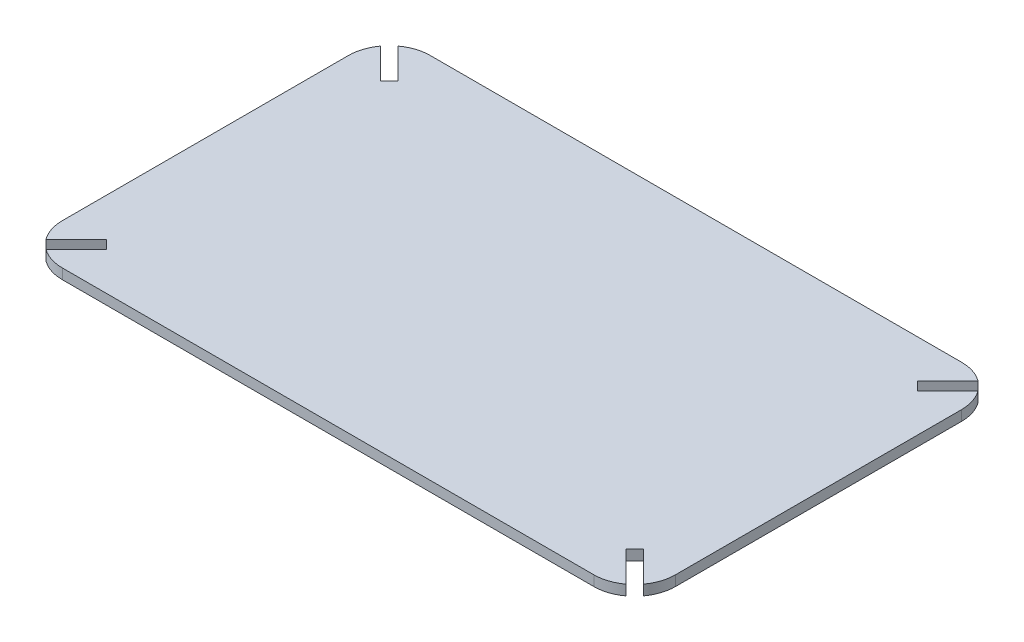
ISO-10303-21;
HEADER;
FILE_DESCRIPTION(('STEP AP214'),'2;1');
FILE_NAME('part.step','',(''),(''),'','','');
FILE_SCHEMA(('AUTOMOTIVE_DESIGN { 1 0 10303 214 1 1 1 1 }'));
ENDSEC;
DATA;
#1=APPLICATION_CONTEXT('core data for automotive mechanical design processes');
#2=APPLICATION_PROTOCOL_DEFINITION('international standard','automotive_design',2000,#1);
#3=PRODUCT_CONTEXT('',#1,'mechanical');
#4=PRODUCT('Part','Part','',(#3));
#5=PRODUCT_RELATED_PRODUCT_CATEGORY('part','',(#4));
#6=PRODUCT_DEFINITION_FORMATION('','',#4);
#7=PRODUCT_DEFINITION_CONTEXT('part definition',#1,'design');
#8=PRODUCT_DEFINITION('design','',#6,#7);
#9=PRODUCT_DEFINITION_SHAPE('','',#8);
#10=(LENGTH_UNIT() NAMED_UNIT(*) SI_UNIT(.MILLI.,.METRE.));
#11=(NAMED_UNIT(*) PLANE_ANGLE_UNIT() SI_UNIT($,.RADIAN.));
#12=(NAMED_UNIT(*) SI_UNIT($,.STERADIAN.) SOLID_ANGLE_UNIT());
#13=UNCERTAINTY_MEASURE_WITH_UNIT(LENGTH_MEASURE(1.E-05),#10,'distance_accuracy_value','');
#14=(GEOMETRIC_REPRESENTATION_CONTEXT(3) GLOBAL_UNCERTAINTY_ASSIGNED_CONTEXT((#13)) GLOBAL_UNIT_ASSIGNED_CONTEXT((#10,
#11,#12)) REPRESENTATION_CONTEXT('',''));
#15=CARTESIAN_POINT('',(0.,0.,0.));
#16=DIRECTION('',(0.,0.,1.));
#17=DIRECTION('',(1.,0.,0.));
#18=AXIS2_PLACEMENT_3D('',#15,#16,#17);
#19=CARTESIAN_POINT('',(-165.1,6.35,88.9));
#20=DIRECTION('',(0.,-1.,0.));
#21=DIRECTION('',(0.,0.,-1.));
#22=AXIS2_PLACEMENT_3D('',#19,#20,#21);
#23=PLANE('',#22);
#24=DIRECTION('',(-0.707106781186547,0.,-0.707106781186548));
#25=VECTOR('',#24,1.);
#26=CARTESIAN_POINT('',(166.692845928795,6.35,85.1046922561532));
#27=LINE('',#26,#25);
#28=CARTESIAN_POINT('',(185.55138378304,6.35,103.963230110398));
#29=VERTEX_POINT('',#28);
#30=CARTESIAN_POINT('',(166.692845928795,6.35,85.1046922561532));
#31=VERTEX_POINT('',#30);
#32=EDGE_CURVE('E200',#29,#31,#27,.T.);
#33=ORIENTED_EDGE('',*,*,#32,.F.);
#34=CARTESIAN_POINT('',(165.1,6.35,88.9));
#35=DIRECTION('',(0.,1.,0.));
#36=DIRECTION('',(0.,0.,1.));
#37=AXIS2_PLACEMENT_3D('',#34,#35,#36);
#38=CIRCLE('',#37,25.4);
#39=CARTESIAN_POINT('',(190.5,6.35,88.9));
#40=VERTEX_POINT('',#39);
#41=EDGE_CURVE('E212',#29,#40,#38,.T.);
#42=ORIENTED_EDGE('',*,*,#41,.T.);
#43=DIRECTION('',(0.,0.,-1.));
#44=VECTOR('',#43,1.);
#45=CARTESIAN_POINT('',(190.5,6.35,88.9));
#46=LINE('',#45,#44);
#47=CARTESIAN_POINT('',(190.5,6.35,-88.9));
#48=VERTEX_POINT('',#47);
#49=EDGE_CURVE('E225',#40,#48,#46,.T.);
#50=ORIENTED_EDGE('',*,*,#49,.T.);
#51=CARTESIAN_POINT('',(165.1,6.35,-88.9));
#52=DIRECTION('',(0.,1.,0.));
#53=DIRECTION('',(0.,0.,-1.));
#54=AXIS2_PLACEMENT_3D('',#51,#52,#53);
#55=CIRCLE('',#54,25.4);
#56=CARTESIAN_POINT('',(185.55138378304,6.35,-103.963230110398));
#57=VERTEX_POINT('',#56);
#58=EDGE_CURVE('E232',#48,#57,#55,.T.);
#59=ORIENTED_EDGE('',*,*,#58,.T.);
#60=DIRECTION('',(0.707106781186548,0.,-0.707106781186547));
#61=VECTOR('',#60,1.);
#62=CARTESIAN_POINT('',(166.692845928795,6.35,-85.1046922561532));
#63=LINE('',#62,#61);
#64=CARTESIAN_POINT('',(166.692845928795,6.35,-85.1046922561532));
#65=VERTEX_POINT('',#64);
#66=EDGE_CURVE('E58',#65,#57,#63,.T.);
#67=ORIENTED_EDGE('',*,*,#66,.F.);
#68=DIRECTION('',(0.707106781186548,0.,0.707106781186547));
#69=VECTOR('',#68,1.);
#70=CARTESIAN_POINT('',(161.304692256153,6.35,-90.4928459287947));
#71=LINE('',#70,#69);
#72=CARTESIAN_POINT('',(161.304692256153,6.35,-90.4928459287947));
#73=VERTEX_POINT('',#72);
#74=EDGE_CURVE('E311',#73,#65,#71,.T.);
#75=ORIENTED_EDGE('',*,*,#74,.F.);
#76=DIRECTION('',(-0.707106781186547,0.,0.707106781186547));
#77=VECTOR('',#76,1.);
#78=CARTESIAN_POINT('',(180.163230110398,6.35,-109.35138378304));
#79=LINE('',#78,#77);
#80=CARTESIAN_POINT('',(180.163230110398,6.35,-109.35138378304));
#81=VERTEX_POINT('',#80);
#82=EDGE_CURVE('E309',#81,#73,#79,.T.);
#83=ORIENTED_EDGE('',*,*,#82,.F.);
#84=CARTESIAN_POINT('',(165.1,6.35,-114.3));
#85=VERTEX_POINT('',#84);
#86=EDGE_CURVE('E231',#81,#85,#55,.T.);
#87=ORIENTED_EDGE('',*,*,#86,.T.);
#88=DIRECTION('',(-1.,0.,0.));
#89=VECTOR('',#88,1.);
#90=CARTESIAN_POINT('',(-165.1,6.35,-114.3));
#91=LINE('',#90,#89);
#92=CARTESIAN_POINT('',(-165.1,6.35,-114.3));
#93=VERTEX_POINT('',#92);
#94=EDGE_CURVE('E235',#85,#93,#91,.T.);
#95=ORIENTED_EDGE('',*,*,#94,.T.);
#96=CARTESIAN_POINT('',(-165.1,6.35,-88.9));
#97=DIRECTION('',(0.,1.,0.));
#98=DIRECTION('',(0.,0.,-1.));
#99=AXIS2_PLACEMENT_3D('',#96,#97,#98);
#100=CIRCLE('',#99,25.4);
#101=CARTESIAN_POINT('',(-180.163230110398,6.35,-109.35138378304));
#102=VERTEX_POINT('',#101);
#103=EDGE_CURVE('E238',#93,#102,#100,.T.);
#104=ORIENTED_EDGE('',*,*,#103,.T.);
#105=DIRECTION('',(-0.707106781186547,0.,-0.707106781186547));
#106=VECTOR('',#105,1.);
#107=CARTESIAN_POINT('',(-180.163230110398,6.35,-109.35138378304));
#108=LINE('',#107,#106);
#109=CARTESIAN_POINT('',(-161.304692256153,6.35,-90.4928459287946));
#110=VERTEX_POINT('',#109);
#111=EDGE_CURVE('E338',#110,#102,#108,.T.);
#112=ORIENTED_EDGE('',*,*,#111,.F.);
#113=DIRECTION('',(0.707106781186548,0.,-0.707106781186547));
#114=VECTOR('',#113,1.);
#115=CARTESIAN_POINT('',(-161.304692256153,6.35,-90.4928459287946));
#116=LINE('',#115,#114);
#117=CARTESIAN_POINT('',(-166.692845928795,6.35,-85.1046922561532));
#118=VERTEX_POINT('',#117);
#119=EDGE_CURVE('E335',#118,#110,#116,.T.);
#120=ORIENTED_EDGE('',*,*,#119,.F.);
#121=DIRECTION('',(0.707106781186548,0.,0.707106781186547));
#122=VECTOR('',#121,1.);
#123=CARTESIAN_POINT('',(-166.692845928795,6.35,-85.1046922561532));
#124=LINE('',#123,#122);
#125=CARTESIAN_POINT('',(-185.55138378304,6.35,-103.963230110398));
#126=VERTEX_POINT('',#125);
#127=EDGE_CURVE('E333',#126,#118,#124,.T.);
#128=ORIENTED_EDGE('',*,*,#127,.F.);
#129=CARTESIAN_POINT('',(-190.5,6.35,-88.9));
#130=VERTEX_POINT('',#129);
#131=EDGE_CURVE('E237',#126,#130,#100,.T.);
#132=ORIENTED_EDGE('',*,*,#131,.T.);
#133=DIRECTION('',(0.,0.,1.));
#134=VECTOR('',#133,1.);
#135=CARTESIAN_POINT('',(-190.5,6.35,88.9));
#136=LINE('',#135,#134);
#137=CARTESIAN_POINT('',(-190.5,6.35,88.9));
#138=VERTEX_POINT('',#137);
#139=EDGE_CURVE('E241',#130,#138,#136,.T.);
#140=ORIENTED_EDGE('',*,*,#139,.T.);
#141=CARTESIAN_POINT('',(-165.1,6.35,88.9));
#142=DIRECTION('',(0.,1.,0.));
#143=DIRECTION('',(0.,0.,-1.));
#144=AXIS2_PLACEMENT_3D('',#141,#142,#143);
#145=CIRCLE('',#144,25.4);
#146=CARTESIAN_POINT('',(-185.55138378304,6.35,103.963230110398));
#147=VERTEX_POINT('',#146);
#148=EDGE_CURVE('E226',#138,#147,#145,.T.);
#149=ORIENTED_EDGE('',*,*,#148,.T.);
#150=DIRECTION('',(-0.707106781186547,0.,0.707106781186548));
#151=VECTOR('',#150,1.);
#152=CARTESIAN_POINT('',(-166.692845928795,6.35,85.1046922561532));
#153=LINE('',#152,#151);
#154=CARTESIAN_POINT('',(-166.692845928795,6.35,85.1046922561532));
#155=VERTEX_POINT('',#154);
#156=EDGE_CURVE('E361',#155,#147,#153,.T.);
#157=ORIENTED_EDGE('',*,*,#156,.F.);
#158=DIRECTION('',(-0.707106781186548,0.,-0.707106781186547));
#159=VECTOR('',#158,1.);
#160=CARTESIAN_POINT('',(-161.304692256153,6.35,90.4928459287947));
#161=LINE('',#160,#159);
#162=CARTESIAN_POINT('',(-161.304692256153,6.35,90.4928459287947));
#163=VERTEX_POINT('',#162);
#164=EDGE_CURVE('E358',#163,#155,#161,.T.);
#165=ORIENTED_EDGE('',*,*,#164,.F.);
#166=DIRECTION('',(0.707106781186547,0.,-0.707106781186548));
#167=VECTOR('',#166,1.);
#168=CARTESIAN_POINT('',(-180.163230110398,6.35,109.35138378304));
#169=LINE('',#168,#167);
#170=CARTESIAN_POINT('',(-180.163230110398,6.35,109.35138378304));
#171=VERTEX_POINT('',#170);
#172=EDGE_CURVE('E356',#171,#163,#169,.T.);
#173=ORIENTED_EDGE('',*,*,#172,.F.);
#174=CARTESIAN_POINT('',(-165.1,6.35,114.3));
#175=VERTEX_POINT('',#174);
#176=EDGE_CURVE('E268',#171,#175,#145,.T.);
#177=ORIENTED_EDGE('',*,*,#176,.T.);
#178=DIRECTION('',(1.,0.,0.));
#179=VECTOR('',#178,1.);
#180=CARTESIAN_POINT('',(-165.1,6.35,114.3));
#181=LINE('',#180,#179);
#182=CARTESIAN_POINT('',(165.1,6.35,114.3));
#183=VERTEX_POINT('',#182);
#184=EDGE_CURVE('E222',#175,#183,#181,.T.);
#185=ORIENTED_EDGE('',*,*,#184,.T.);
#186=CARTESIAN_POINT('',(180.163230110398,6.35,109.35138378304));
#187=VERTEX_POINT('',#186);
#188=EDGE_CURVE('E221',#183,#187,#38,.T.);
#189=ORIENTED_EDGE('',*,*,#188,.T.);
#190=DIRECTION('',(0.707106781186547,0.,0.707106781186548));
#191=VECTOR('',#190,1.);
#192=CARTESIAN_POINT('',(180.163230110398,6.35,109.35138378304));
#193=LINE('',#192,#191);
#194=CARTESIAN_POINT('',(161.304692256153,6.35,90.4928459287946));
#195=VERTEX_POINT('',#194);
#196=EDGE_CURVE('E50',#195,#187,#193,.T.);
#197=ORIENTED_EDGE('',*,*,#196,.F.);
#198=DIRECTION('',(-0.707106781186548,0.,0.707106781186547));
#199=VECTOR('',#198,1.);
#200=CARTESIAN_POINT('',(161.304692256153,6.35,90.4928459287946));
#201=LINE('',#200,#199);
#202=EDGE_CURVE('E214',#31,#195,#201,.T.);
#203=ORIENTED_EDGE('',*,*,#202,.F.);
#204=EDGE_LOOP('',(#33,#42,#50,#59,#67,#75,#83,#87,#95,#104,#112,#120,#128,#132,#140,#149,#157,
#165,#173,#177,#185,#189,#197,#203));
#205=FACE_BOUND('',#204,.T.);
#206=ADVANCED_FACE('F35',(#205),#23,.F.);
#207=CARTESIAN_POINT('',(-165.1,0.,88.9));
#208=DIRECTION('',(0.,-1.,0.));
#209=DIRECTION('',(0.,0.,-1.));
#210=AXIS2_PLACEMENT_3D('',#207,#208,#209);
#211=PLANE('',#210);
#212=CARTESIAN_POINT('',(165.1,0.,88.9));
#213=DIRECTION('',(0.,1.,0.));
#214=DIRECTION('',(0.,0.,1.));
#215=AXIS2_PLACEMENT_3D('',#212,#213,#214);
#216=CIRCLE('',#215,25.4);
#217=CARTESIAN_POINT('',(185.55138378304,0.,103.963230110398));
#218=VERTEX_POINT('',#217);
#219=CARTESIAN_POINT('',(190.5,0.,88.9));
#220=VERTEX_POINT('',#219);
#221=EDGE_CURVE('E250',#218,#220,#216,.T.);
#222=ORIENTED_EDGE('',*,*,#221,.F.);
#223=DIRECTION('',(-0.707106781186547,0.,-0.707106781186548));
#224=VECTOR('',#223,1.);
#225=CARTESIAN_POINT('',(166.692845928795,0.,85.1046922561532));
#226=LINE('',#225,#224);
#227=CARTESIAN_POINT('',(166.692845928795,0.,85.1046922561532));
#228=VERTEX_POINT('',#227);
#229=EDGE_CURVE('E203',#218,#228,#226,.T.);
#230=ORIENTED_EDGE('',*,*,#229,.T.);
#231=DIRECTION('',(-0.707106781186548,0.,0.707106781186547));
#232=VECTOR('',#231,1.);
#233=CARTESIAN_POINT('',(161.304692256153,0.,90.4928459287946));
#234=LINE('',#233,#232);
#235=CARTESIAN_POINT('',(161.304692256153,0.,90.4928459287946));
#236=VERTEX_POINT('',#235);
#237=EDGE_CURVE('E299',#228,#236,#234,.T.);
#238=ORIENTED_EDGE('',*,*,#237,.T.);
#239=DIRECTION('',(0.707106781186547,0.,0.707106781186548));
#240=VECTOR('',#239,1.);
#241=CARTESIAN_POINT('',(180.163230110398,0.,109.35138378304));
#242=LINE('',#241,#240);
#243=CARTESIAN_POINT('',(180.163230110398,0.,109.35138378304));
#244=VERTEX_POINT('',#243);
#245=EDGE_CURVE('E215',#236,#244,#242,.T.);
#246=ORIENTED_EDGE('',*,*,#245,.T.);
#247=CARTESIAN_POINT('',(165.1,0.,114.3));
#248=VERTEX_POINT('',#247);
#249=EDGE_CURVE('E251',#248,#244,#216,.T.);
#250=ORIENTED_EDGE('',*,*,#249,.F.);
#251=DIRECTION('',(1.,0.,0.));
#252=VECTOR('',#251,1.);
#253=CARTESIAN_POINT('',(-165.1,0.,114.3));
#254=LINE('',#253,#252);
#255=CARTESIAN_POINT('',(-165.1,0.,114.3));
#256=VERTEX_POINT('',#255);
#257=EDGE_CURVE('E247',#256,#248,#254,.T.);
#258=ORIENTED_EDGE('',*,*,#257,.F.);
#259=CARTESIAN_POINT('',(-165.1,0.,88.9));
#260=DIRECTION('',(0.,1.,0.));
#261=DIRECTION('',(0.,0.,-1.));
#262=AXIS2_PLACEMENT_3D('',#259,#260,#261);
#263=CIRCLE('',#262,25.4);
#264=CARTESIAN_POINT('',(-180.163230110398,0.,109.35138378304));
#265=VERTEX_POINT('',#264);
#266=EDGE_CURVE('E248',#265,#256,#263,.T.);
#267=ORIENTED_EDGE('',*,*,#266,.F.);
#268=DIRECTION('',(0.707106781186547,0.,-0.707106781186548));
#269=VECTOR('',#268,1.);
#270=CARTESIAN_POINT('',(-180.163230110398,0.,109.35138378304));
#271=LINE('',#270,#269);
#272=CARTESIAN_POINT('',(-161.304692256153,0.,90.4928459287947));
#273=VERTEX_POINT('',#272);
#274=EDGE_CURVE('E207',#265,#273,#271,.T.);
#275=ORIENTED_EDGE('',*,*,#274,.T.);
#276=DIRECTION('',(-0.707106781186548,0.,-0.707106781186547));
#277=VECTOR('',#276,1.);
#278=CARTESIAN_POINT('',(-161.304692256153,0.,90.4928459287947));
#279=LINE('',#278,#277);
#280=CARTESIAN_POINT('',(-166.692845928795,0.,85.1046922561532));
#281=VERTEX_POINT('',#280);
#282=EDGE_CURVE('E366',#273,#281,#279,.T.);
#283=ORIENTED_EDGE('',*,*,#282,.T.);
#284=DIRECTION('',(-0.707106781186547,0.,0.707106781186548));
#285=VECTOR('',#284,1.);
#286=CARTESIAN_POINT('',(-166.692845928795,0.,85.1046922561532));
#287=LINE('',#286,#285);
#288=CARTESIAN_POINT('',(-185.55138378304,0.,103.963230110398));
#289=VERTEX_POINT('',#288);
#290=EDGE_CURVE('E359',#281,#289,#287,.T.);
#291=ORIENTED_EDGE('',*,*,#290,.T.);
#292=CARTESIAN_POINT('',(-190.5,0.,88.9));
#293=VERTEX_POINT('',#292);
#294=EDGE_CURVE('E244',#293,#289,#263,.T.);
#295=ORIENTED_EDGE('',*,*,#294,.F.);
#296=DIRECTION('',(0.,0.,1.));
#297=VECTOR('',#296,1.);
#298=CARTESIAN_POINT('',(-190.5,0.,88.9));
#299=LINE('',#298,#297);
#300=CARTESIAN_POINT('',(-190.5,0.,-88.9));
#301=VERTEX_POINT('',#300);
#302=EDGE_CURVE('E266',#301,#293,#299,.T.);
#303=ORIENTED_EDGE('',*,*,#302,.F.);
#304=CARTESIAN_POINT('',(-165.1,0.,-88.9));
#305=DIRECTION('',(0.,1.,0.));
#306=DIRECTION('',(0.,0.,-1.));
#307=AXIS2_PLACEMENT_3D('',#304,#305,#306);
#308=CIRCLE('',#307,25.4);
#309=CARTESIAN_POINT('',(-185.55138378304,0.,-103.963230110398));
#310=VERTEX_POINT('',#309);
#311=EDGE_CURVE('E262',#310,#301,#308,.T.);
#312=ORIENTED_EDGE('',*,*,#311,.F.);
#313=DIRECTION('',(0.707106781186548,0.,0.707106781186547));
#314=VECTOR('',#313,1.);
#315=CARTESIAN_POINT('',(-166.692845928795,0.,-85.1046922561532));
#316=LINE('',#315,#314);
#317=CARTESIAN_POINT('',(-166.692845928795,0.,-85.1046922561532));
#318=VERTEX_POINT('',#317);
#319=EDGE_CURVE('E341',#310,#318,#316,.T.);
#320=ORIENTED_EDGE('',*,*,#319,.T.);
#321=DIRECTION('',(0.707106781186548,0.,-0.707106781186547));
#322=VECTOR('',#321,1.);
#323=CARTESIAN_POINT('',(-161.304692256153,0.,-90.4928459287946));
#324=LINE('',#323,#322);
#325=CARTESIAN_POINT('',(-161.304692256153,0.,-90.4928459287946));
#326=VERTEX_POINT('',#325);
#327=EDGE_CURVE('E344',#318,#326,#324,.T.);
#328=ORIENTED_EDGE('',*,*,#327,.T.);
#329=DIRECTION('',(-0.707106781186547,0.,-0.707106781186547));
#330=VECTOR('',#329,1.);
#331=CARTESIAN_POINT('',(-180.163230110398,0.,-109.35138378304));
#332=LINE('',#331,#330);
#333=CARTESIAN_POINT('',(-180.163230110398,0.,-109.35138378304));
#334=VERTEX_POINT('',#333);
#335=EDGE_CURVE('E336',#326,#334,#332,.T.);
#336=ORIENTED_EDGE('',*,*,#335,.T.);
#337=CARTESIAN_POINT('',(-165.1,0.,-114.3));
#338=VERTEX_POINT('',#337);
#339=EDGE_CURVE('E263',#338,#334,#308,.T.);
#340=ORIENTED_EDGE('',*,*,#339,.F.);
#341=DIRECTION('',(-1.,0.,0.));
#342=VECTOR('',#341,1.);
#343=CARTESIAN_POINT('',(-165.1,0.,-114.3));
#344=LINE('',#343,#342);
#345=CARTESIAN_POINT('',(165.1,0.,-114.3));
#346=VERTEX_POINT('',#345);
#347=EDGE_CURVE('E260',#346,#338,#344,.T.);
#348=ORIENTED_EDGE('',*,*,#347,.F.);
#349=CARTESIAN_POINT('',(165.1,0.,-88.9));
#350=DIRECTION('',(0.,1.,0.));
#351=DIRECTION('',(0.,0.,-1.));
#352=AXIS2_PLACEMENT_3D('',#349,#350,#351);
#353=CIRCLE('',#352,25.4);
#354=CARTESIAN_POINT('',(180.163230110398,0.,-109.35138378304));
#355=VERTEX_POINT('',#354);
#356=EDGE_CURVE('E256',#355,#346,#353,.T.);
#357=ORIENTED_EDGE('',*,*,#356,.F.);
#358=DIRECTION('',(-0.707106781186547,0.,0.707106781186547));
#359=VECTOR('',#358,1.);
#360=CARTESIAN_POINT('',(180.163230110398,0.,-109.35138378304));
#361=LINE('',#360,#359);
#362=CARTESIAN_POINT('',(161.304692256153,0.,-90.4928459287947));
#363=VERTEX_POINT('',#362);
#364=EDGE_CURVE('E316',#355,#363,#361,.T.);
#365=ORIENTED_EDGE('',*,*,#364,.T.);
#366=DIRECTION('',(0.707106781186548,0.,0.707106781186547));
#367=VECTOR('',#366,1.);
#368=CARTESIAN_POINT('',(161.304692256153,0.,-90.4928459287947));
#369=LINE('',#368,#367);
#370=CARTESIAN_POINT('',(166.692845928795,0.,-85.1046922561532));
#371=VERTEX_POINT('',#370);
#372=EDGE_CURVE('E319',#363,#371,#369,.T.);
#373=ORIENTED_EDGE('',*,*,#372,.T.);
#374=DIRECTION('',(0.707106781186548,0.,-0.707106781186547));
#375=VECTOR('',#374,1.);
#376=CARTESIAN_POINT('',(166.692845928795,0.,-85.1046922561532));
#377=LINE('',#376,#375);
#378=CARTESIAN_POINT('',(185.55138378304,0.,-103.963230110398));
#379=VERTEX_POINT('',#378);
#380=EDGE_CURVE('E312',#371,#379,#377,.T.);
#381=ORIENTED_EDGE('',*,*,#380,.T.);
#382=CARTESIAN_POINT('',(190.5,0.,-88.9));
#383=VERTEX_POINT('',#382);
#384=EDGE_CURVE('E257',#383,#379,#353,.T.);
#385=ORIENTED_EDGE('',*,*,#384,.F.);
#386=DIRECTION('',(0.,0.,-1.));
#387=VECTOR('',#386,1.);
#388=CARTESIAN_POINT('',(190.5,0.,88.9));
#389=LINE('',#388,#387);
#390=EDGE_CURVE('E254',#220,#383,#389,.T.);
#391=ORIENTED_EDGE('',*,*,#390,.F.);
#392=EDGE_LOOP('',(#222,#230,#238,#246,#250,#258,#267,#275,#283,#291,#295,#303,#312,#320,#328,
#336,#340,#348,#357,#365,#373,#381,#385,#391));
#393=FACE_BOUND('',#392,.T.);
#394=ADVANCED_FACE('F294',(#393),#211,.T.);
#395=CARTESIAN_POINT('',(165.1,6.35,88.9));
#396=DIRECTION('',(0.,-1.,0.));
#397=DIRECTION('',(0.,0.,-1.));
#398=AXIS2_PLACEMENT_3D('',#395,#396,#397);
#399=CYLINDRICAL_SURFACE('',#398,25.4);
#400=DIRECTION('',(0.,-1.,0.));
#401=VECTOR('',#400,1.);
#402=CARTESIAN_POINT('',(185.55138378304,6.35,103.963230110398));
#403=LINE('',#402,#401);
#404=EDGE_CURVE('E197',#29,#218,#403,.T.);
#405=ORIENTED_EDGE('',*,*,#404,.T.);
#406=ORIENTED_EDGE('',*,*,#221,.T.);
#407=DIRECTION('',(0.,-1.,0.));
#408=VECTOR('',#407,1.);
#409=CARTESIAN_POINT('',(190.5,6.35,88.9));
#410=LINE('',#409,#408);
#411=EDGE_CURVE('E219',#40,#220,#410,.T.);
#412=ORIENTED_EDGE('',*,*,#411,.F.);
#413=ORIENTED_EDGE('',*,*,#41,.F.);
#414=EDGE_LOOP('',(#405,#406,#412,#413));
#415=FACE_BOUND('',#414,.T.);
#416=ADVANCED_FACE('F217',(#415),#399,.T.);
#417=DIRECTION('',(0.,-1.,0.));
#418=VECTOR('',#417,1.);
#419=CARTESIAN_POINT('',(180.163230110398,6.35,109.35138378304));
#420=LINE('',#419,#418);
#421=EDGE_CURVE('E304',#187,#244,#420,.T.);
#422=ORIENTED_EDGE('',*,*,#421,.F.);
#423=ORIENTED_EDGE('',*,*,#188,.F.);
#424=DIRECTION('',(0.,-1.,0.));
#425=VECTOR('',#424,1.);
#426=CARTESIAN_POINT('',(165.1,6.35,114.3));
#427=LINE('',#426,#425);
#428=EDGE_CURVE('E43',#183,#248,#427,.T.);
#429=ORIENTED_EDGE('',*,*,#428,.T.);
#430=ORIENTED_EDGE('',*,*,#249,.T.);
#431=EDGE_LOOP('',(#422,#423,#429,#430));
#432=FACE_BOUND('',#431,.T.);
#433=ADVANCED_FACE('F288',(#432),#399,.T.);
#434=CARTESIAN_POINT('',(165.1,6.35,-88.9));
#435=DIRECTION('',(0.,-1.,0.));
#436=DIRECTION('',(0.,0.,-1.));
#437=AXIS2_PLACEMENT_3D('',#434,#435,#436);
#438=CYLINDRICAL_SURFACE('',#437,25.4);
#439=DIRECTION('',(0.,-1.,0.));
#440=VECTOR('',#439,1.);
#441=CARTESIAN_POINT('',(180.163230110398,6.35,-109.35138378304));
#442=LINE('',#441,#440);
#443=EDGE_CURVE('E330',#81,#355,#442,.T.);
#444=ORIENTED_EDGE('',*,*,#443,.T.);
#445=ORIENTED_EDGE('',*,*,#356,.T.);
#446=DIRECTION('',(0.,-1.,0.));
#447=VECTOR('',#446,1.);
#448=CARTESIAN_POINT('',(165.1,6.35,-114.3));
#449=LINE('',#448,#447);
#450=EDGE_CURVE('E277',#85,#346,#449,.T.);
#451=ORIENTED_EDGE('',*,*,#450,.F.);
#452=ORIENTED_EDGE('',*,*,#86,.F.);
#453=EDGE_LOOP('',(#444,#445,#451,#452));
#454=FACE_BOUND('',#453,.T.);
#455=ADVANCED_FACE('F437',(#454),#438,.T.);
#456=DIRECTION('',(0.,-1.,0.));
#457=VECTOR('',#456,1.);
#458=CARTESIAN_POINT('',(185.55138378304,6.35,-103.963230110398));
#459=LINE('',#458,#457);
#460=EDGE_CURVE('E315',#57,#379,#459,.T.);
#461=ORIENTED_EDGE('',*,*,#460,.F.);
#462=ORIENTED_EDGE('',*,*,#58,.F.);
#463=DIRECTION('',(0.,-1.,0.));
#464=VECTOR('',#463,1.);
#465=CARTESIAN_POINT('',(190.5,6.35,-88.9));
#466=LINE('',#465,#464);
#467=EDGE_CURVE('E280',#48,#383,#466,.T.);
#468=ORIENTED_EDGE('',*,*,#467,.T.);
#469=ORIENTED_EDGE('',*,*,#384,.T.);
#470=EDGE_LOOP('',(#461,#462,#468,#469));
#471=FACE_BOUND('',#470,.T.);
#472=ADVANCED_FACE('F452',(#471),#438,.T.);
#473=CARTESIAN_POINT('',(-165.1,6.35,-88.9));
#474=DIRECTION('',(0.,-1.,0.));
#475=DIRECTION('',(0.,0.,-1.));
#476=AXIS2_PLACEMENT_3D('',#473,#474,#475);
#477=CYLINDRICAL_SURFACE('',#476,25.4);
#478=DIRECTION('',(0.,-1.,0.));
#479=VECTOR('',#478,1.);
#480=CARTESIAN_POINT('',(-185.55138378304,6.35,-103.963230110398));
#481=LINE('',#480,#479);
#482=EDGE_CURVE('E320',#126,#310,#481,.T.);
#483=ORIENTED_EDGE('',*,*,#482,.T.);
#484=ORIENTED_EDGE('',*,*,#311,.T.);
#485=DIRECTION('',(0.,-1.,0.));
#486=VECTOR('',#485,1.);
#487=CARTESIAN_POINT('',(-190.5,6.35,-88.9));
#488=LINE('',#487,#486);
#489=EDGE_CURVE('E271',#130,#301,#488,.T.);
#490=ORIENTED_EDGE('',*,*,#489,.F.);
#491=ORIENTED_EDGE('',*,*,#131,.F.);
#492=EDGE_LOOP('',(#483,#484,#490,#491));
#493=FACE_BOUND('',#492,.T.);
#494=ADVANCED_FACE('F409',(#493),#477,.T.);
#495=DIRECTION('',(0.,-1.,0.));
#496=VECTOR('',#495,1.);
#497=CARTESIAN_POINT('',(-180.163230110398,6.35,-109.35138378304));
#498=LINE('',#497,#496);
#499=EDGE_CURVE('E340',#102,#334,#498,.T.);
#500=ORIENTED_EDGE('',*,*,#499,.F.);
#501=ORIENTED_EDGE('',*,*,#103,.F.);
#502=DIRECTION('',(0.,-1.,0.));
#503=VECTOR('',#502,1.);
#504=CARTESIAN_POINT('',(-165.1,6.35,-114.3));
#505=LINE('',#504,#503);
#506=EDGE_CURVE('E274',#93,#338,#505,.T.);
#507=ORIENTED_EDGE('',*,*,#506,.T.);
#508=ORIENTED_EDGE('',*,*,#339,.T.);
#509=EDGE_LOOP('',(#500,#501,#507,#508));
#510=FACE_BOUND('',#509,.T.);
#511=ADVANCED_FACE('F428',(#510),#477,.T.);
#512=CARTESIAN_POINT('',(-165.1,6.35,88.9));
#513=DIRECTION('',(0.,-1.,0.));
#514=DIRECTION('',(0.,0.,-1.));
#515=AXIS2_PLACEMENT_3D('',#512,#513,#514);
#516=CYLINDRICAL_SURFACE('',#515,25.4);
#517=DIRECTION('',(0.,-1.,0.));
#518=VECTOR('',#517,1.);
#519=CARTESIAN_POINT('',(-180.163230110398,6.35,109.35138378304));
#520=LINE('',#519,#518);
#521=EDGE_CURVE('E376',#171,#265,#520,.T.);
#522=ORIENTED_EDGE('',*,*,#521,.T.);
#523=ORIENTED_EDGE('',*,*,#266,.T.);
#524=DIRECTION('',(0.,-1.,0.));
#525=VECTOR('',#524,1.);
#526=CARTESIAN_POINT('',(-165.1,6.35,114.3));
#527=LINE('',#526,#525);
#528=EDGE_CURVE('E11',#175,#256,#527,.T.);
#529=ORIENTED_EDGE('',*,*,#528,.F.);
#530=ORIENTED_EDGE('',*,*,#176,.F.);
#531=EDGE_LOOP('',(#522,#523,#529,#530));
#532=FACE_BOUND('',#531,.T.);
#533=ADVANCED_FACE('F37',(#532),#516,.T.);
#534=DIRECTION('',(0.,-1.,0.));
#535=VECTOR('',#534,1.);
#536=CARTESIAN_POINT('',(-185.55138378304,6.35,103.963230110398));
#537=LINE('',#536,#535);
#538=EDGE_CURVE('E363',#147,#289,#537,.T.);
#539=ORIENTED_EDGE('',*,*,#538,.F.);
#540=ORIENTED_EDGE('',*,*,#148,.F.);
#541=DIRECTION('',(0.,-1.,0.));
#542=VECTOR('',#541,1.);
#543=CARTESIAN_POINT('',(-190.5,6.35,88.9));
#544=LINE('',#543,#542);
#545=EDGE_CURVE('E243',#138,#293,#544,.T.);
#546=ORIENTED_EDGE('',*,*,#545,.T.);
#547=ORIENTED_EDGE('',*,*,#294,.T.);
#548=EDGE_LOOP('',(#539,#540,#546,#547));
#549=FACE_BOUND('',#548,.T.);
#550=ADVANCED_FACE('F401',(#549),#516,.T.);
#551=CARTESIAN_POINT('',(-165.1,6.35,114.3));
#552=DIRECTION('',(0.,0.,-1.));
#553=DIRECTION('',(-1.,0.,0.));
#554=AXIS2_PLACEMENT_3D('',#551,#552,#553);
#555=PLANE('',#554);
#556=ORIENTED_EDGE('',*,*,#257,.T.);
#557=ORIENTED_EDGE('',*,*,#428,.F.);
#558=ORIENTED_EDGE('',*,*,#184,.F.);
#559=ORIENTED_EDGE('',*,*,#528,.T.);
#560=EDGE_LOOP('',(#556,#557,#558,#559));
#561=FACE_BOUND('',#560,.T.);
#562=ADVANCED_FACE('F386',(#561),#555,.F.);
#563=CARTESIAN_POINT('',(190.5,6.35,88.9));
#564=DIRECTION('',(-1.,0.,0.));
#565=DIRECTION('',(0.,0.,1.));
#566=AXIS2_PLACEMENT_3D('',#563,#564,#565);
#567=PLANE('',#566);
#568=ORIENTED_EDGE('',*,*,#390,.T.);
#569=ORIENTED_EDGE('',*,*,#467,.F.);
#570=ORIENTED_EDGE('',*,*,#49,.F.);
#571=ORIENTED_EDGE('',*,*,#411,.T.);
#572=EDGE_LOOP('',(#568,#569,#570,#571));
#573=FACE_BOUND('',#572,.T.);
#574=ADVANCED_FACE('F456',(#573),#567,.F.);
#575=CARTESIAN_POINT('',(-165.1,6.35,-114.3));
#576=DIRECTION('',(0.,0.,1.));
#577=DIRECTION('',(1.,0.,0.));
#578=AXIS2_PLACEMENT_3D('',#575,#576,#577);
#579=PLANE('',#578);
#580=ORIENTED_EDGE('',*,*,#347,.T.);
#581=ORIENTED_EDGE('',*,*,#506,.F.);
#582=ORIENTED_EDGE('',*,*,#94,.F.);
#583=ORIENTED_EDGE('',*,*,#450,.T.);
#584=EDGE_LOOP('',(#580,#581,#582,#583));
#585=FACE_BOUND('',#584,.T.);
#586=ADVANCED_FACE('F433',(#585),#579,.F.);
#587=CARTESIAN_POINT('',(-190.5,6.35,88.9));
#588=DIRECTION('',(1.,0.,0.));
#589=DIRECTION('',(0.,0.,-1.));
#590=AXIS2_PLACEMENT_3D('',#587,#588,#589);
#591=PLANE('',#590);
#592=ORIENTED_EDGE('',*,*,#302,.T.);
#593=ORIENTED_EDGE('',*,*,#545,.F.);
#594=ORIENTED_EDGE('',*,*,#139,.F.);
#595=ORIENTED_EDGE('',*,*,#489,.T.);
#596=EDGE_LOOP('',(#592,#593,#594,#595));
#597=FACE_BOUND('',#596,.T.);
#598=ADVANCED_FACE('F405',(#597),#591,.F.);
#599=CARTESIAN_POINT('',(-180.163230110398,6.35,109.35138378304));
#600=DIRECTION('',(-0.707106781186548,0.,-0.707106781186547));
#601=DIRECTION('',(-0.707106781186547,0.,0.707106781186548));
#602=AXIS2_PLACEMENT_3D('',#599,#600,#601);
#603=PLANE('',#602);
#604=ORIENTED_EDGE('',*,*,#274,.F.);
#605=ORIENTED_EDGE('',*,*,#521,.F.);
#606=ORIENTED_EDGE('',*,*,#172,.T.);
#607=DIRECTION('',(0.,-1.,0.));
#608=VECTOR('',#607,1.);
#609=CARTESIAN_POINT('',(-161.304692256153,6.35,90.4928459287947));
#610=LINE('',#609,#608);
#611=EDGE_CURVE('E374',#163,#273,#610,.T.);
#612=ORIENTED_EDGE('',*,*,#611,.T.);
#613=EDGE_LOOP('',(#604,#605,#606,#612));
#614=FACE_BOUND('',#613,.T.);
#615=ADVANCED_FACE('F389',(#614),#603,.T.);
#616=CARTESIAN_POINT('',(-161.304692256153,6.35,90.4928459287947));
#617=DIRECTION('',(-0.707106781186547,0.,0.707106781186548));
#618=DIRECTION('',(0.707106781186548,0.,0.707106781186547));
#619=AXIS2_PLACEMENT_3D('',#616,#617,#618);
#620=PLANE('',#619);
#621=ORIENTED_EDGE('',*,*,#282,.F.);
#622=ORIENTED_EDGE('',*,*,#611,.F.);
#623=ORIENTED_EDGE('',*,*,#164,.T.);
#624=DIRECTION('',(0.,-1.,0.));
#625=VECTOR('',#624,1.);
#626=CARTESIAN_POINT('',(-166.692845928795,6.35,85.1046922561532));
#627=LINE('',#626,#625);
#628=EDGE_CURVE('E372',#155,#281,#627,.T.);
#629=ORIENTED_EDGE('',*,*,#628,.T.);
#630=EDGE_LOOP('',(#621,#622,#623,#629));
#631=FACE_BOUND('',#630,.T.);
#632=ADVANCED_FACE('F392',(#631),#620,.T.);
#633=CARTESIAN_POINT('',(-166.692845928795,6.35,85.1046922561532));
#634=DIRECTION('',(0.707106781186548,0.,0.707106781186547));
#635=DIRECTION('',(0.707106781186547,0.,-0.707106781186548));
#636=AXIS2_PLACEMENT_3D('',#633,#634,#635);
#637=PLANE('',#636);
#638=ORIENTED_EDGE('',*,*,#290,.F.);
#639=ORIENTED_EDGE('',*,*,#628,.F.);
#640=ORIENTED_EDGE('',*,*,#156,.T.);
#641=ORIENTED_EDGE('',*,*,#538,.T.);
#642=EDGE_LOOP('',(#638,#639,#640,#641));
#643=FACE_BOUND('',#642,.T.);
#644=ADVANCED_FACE('F396',(#643),#637,.T.);
#645=CARTESIAN_POINT('',(-166.692845928795,6.35,-85.1046922561532));
#646=DIRECTION('',(0.707106781186547,0.,-0.707106781186548));
#647=DIRECTION('',(-0.707106781186548,0.,-0.707106781186547));
#648=AXIS2_PLACEMENT_3D('',#645,#646,#647);
#649=PLANE('',#648);
#650=ORIENTED_EDGE('',*,*,#319,.F.);
#651=ORIENTED_EDGE('',*,*,#482,.F.);
#652=ORIENTED_EDGE('',*,*,#127,.T.);
#653=DIRECTION('',(0.,-1.,0.));
#654=VECTOR('',#653,1.);
#655=CARTESIAN_POINT('',(-166.692845928795,6.35,-85.1046922561532));
#656=LINE('',#655,#654);
#657=EDGE_CURVE('E352',#118,#318,#656,.T.);
#658=ORIENTED_EDGE('',*,*,#657,.T.);
#659=EDGE_LOOP('',(#650,#651,#652,#658));
#660=FACE_BOUND('',#659,.T.);
#661=ADVANCED_FACE('F413',(#660),#649,.T.);
#662=CARTESIAN_POINT('',(-161.304692256153,6.35,-90.4928459287946));
#663=DIRECTION('',(-0.707106781186547,0.,-0.707106781186548));
#664=DIRECTION('',(-0.707106781186548,0.,0.707106781186547));
#665=AXIS2_PLACEMENT_3D('',#662,#663,#664);
#666=PLANE('',#665);
#667=ORIENTED_EDGE('',*,*,#327,.F.);
#668=ORIENTED_EDGE('',*,*,#657,.F.);
#669=ORIENTED_EDGE('',*,*,#119,.T.);
#670=DIRECTION('',(0.,-1.,0.));
#671=VECTOR('',#670,1.);
#672=CARTESIAN_POINT('',(-161.304692256153,6.35,-90.4928459287946));
#673=LINE('',#672,#671);
#674=EDGE_CURVE('E350',#110,#326,#673,.T.);
#675=ORIENTED_EDGE('',*,*,#674,.T.);
#676=EDGE_LOOP('',(#667,#668,#669,#675));
#677=FACE_BOUND('',#676,.T.);
#678=ADVANCED_FACE('F420',(#677),#666,.T.);
#679=CARTESIAN_POINT('',(-180.163230110398,6.35,-109.35138378304));
#680=DIRECTION('',(-0.707106781186548,0.,0.707106781186548));
#681=DIRECTION('',(0.707106781186548,0.,0.707106781186548));
#682=AXIS2_PLACEMENT_3D('',#679,#680,#681);
#683=PLANE('',#682);
#684=ORIENTED_EDGE('',*,*,#335,.F.);
#685=ORIENTED_EDGE('',*,*,#674,.F.);
#686=ORIENTED_EDGE('',*,*,#111,.T.);
#687=ORIENTED_EDGE('',*,*,#499,.T.);
#688=EDGE_LOOP('',(#684,#685,#686,#687));
#689=FACE_BOUND('',#688,.T.);
#690=ADVANCED_FACE('F423',(#689),#683,.T.);
#691=CARTESIAN_POINT('',(180.163230110398,6.35,-109.35138378304));
#692=DIRECTION('',(0.707106781186548,0.,0.707106781186548));
#693=DIRECTION('',(0.707106781186548,0.,-0.707106781186548));
#694=AXIS2_PLACEMENT_3D('',#691,#692,#693);
#695=PLANE('',#694);
#696=ORIENTED_EDGE('',*,*,#364,.F.);
#697=ORIENTED_EDGE('',*,*,#443,.F.);
#698=ORIENTED_EDGE('',*,*,#82,.T.);
#699=DIRECTION('',(0.,-1.,0.));
#700=VECTOR('',#699,1.);
#701=CARTESIAN_POINT('',(161.304692256153,6.35,-90.4928459287947));
#702=LINE('',#701,#700);
#703=EDGE_CURVE('E328',#73,#363,#702,.T.);
#704=ORIENTED_EDGE('',*,*,#703,.T.);
#705=EDGE_LOOP('',(#696,#697,#698,#704));
#706=FACE_BOUND('',#705,.T.);
#707=ADVANCED_FACE('F441',(#706),#695,.T.);
#708=CARTESIAN_POINT('',(161.304692256153,6.35,-90.4928459287947));
#709=DIRECTION('',(0.707106781186547,0.,-0.707106781186548));
#710=DIRECTION('',(-0.707106781186548,0.,-0.707106781186547));
#711=AXIS2_PLACEMENT_3D('',#708,#709,#710);
#712=PLANE('',#711);
#713=ORIENTED_EDGE('',*,*,#372,.F.);
#714=ORIENTED_EDGE('',*,*,#703,.F.);
#715=ORIENTED_EDGE('',*,*,#74,.T.);
#716=DIRECTION('',(0.,-1.,0.));
#717=VECTOR('',#716,1.);
#718=CARTESIAN_POINT('',(166.692845928795,6.35,-85.1046922561532));
#719=LINE('',#718,#717);
#720=EDGE_CURVE('E326',#65,#371,#719,.T.);
#721=ORIENTED_EDGE('',*,*,#720,.T.);
#722=EDGE_LOOP('',(#713,#714,#715,#721));
#723=FACE_BOUND('',#722,.T.);
#724=ADVANCED_FACE('F446',(#723),#712,.T.);
#725=CARTESIAN_POINT('',(166.692845928795,6.35,-85.1046922561532));
#726=DIRECTION('',(-0.707106781186547,0.,-0.707106781186548));
#727=DIRECTION('',(-0.707106781186548,0.,0.707106781186547));
#728=AXIS2_PLACEMENT_3D('',#725,#726,#727);
#729=PLANE('',#728);
#730=ORIENTED_EDGE('',*,*,#380,.F.);
#731=ORIENTED_EDGE('',*,*,#720,.F.);
#732=ORIENTED_EDGE('',*,*,#66,.T.);
#733=ORIENTED_EDGE('',*,*,#460,.T.);
#734=EDGE_LOOP('',(#730,#731,#732,#733));
#735=FACE_BOUND('',#734,.T.);
#736=ADVANCED_FACE('F448',(#735),#729,.T.);
#737=CARTESIAN_POINT('',(166.692845928795,6.35,85.1046922561532));
#738=DIRECTION('',(-0.707106781186548,0.,0.707106781186547));
#739=DIRECTION('',(0.707106781186547,0.,0.707106781186548));
#740=AXIS2_PLACEMENT_3D('',#737,#738,#739);
#741=PLANE('',#740);
#742=ORIENTED_EDGE('',*,*,#229,.F.);
#743=ORIENTED_EDGE('',*,*,#404,.F.);
#744=ORIENTED_EDGE('',*,*,#32,.T.);
#745=DIRECTION('',(0.,-1.,0.));
#746=VECTOR('',#745,1.);
#747=CARTESIAN_POINT('',(166.692845928795,6.35,85.1046922561532));
#748=LINE('',#747,#746);
#749=EDGE_CURVE('E208',#31,#228,#748,.T.);
#750=ORIENTED_EDGE('',*,*,#749,.T.);
#751=EDGE_LOOP('',(#742,#743,#744,#750));
#752=FACE_BOUND('',#751,.T.);
#753=ADVANCED_FACE('F199',(#752),#741,.T.);
#754=CARTESIAN_POINT('',(161.304692256153,6.35,90.4928459287946));
#755=DIRECTION('',(0.707106781186547,0.,0.707106781186548));
#756=DIRECTION('',(0.707106781186548,0.,-0.707106781186547));
#757=AXIS2_PLACEMENT_3D('',#754,#755,#756);
#758=PLANE('',#757);
#759=ORIENTED_EDGE('',*,*,#237,.F.);
#760=ORIENTED_EDGE('',*,*,#749,.F.);
#761=ORIENTED_EDGE('',*,*,#202,.T.);
#762=DIRECTION('',(0.,-1.,0.));
#763=VECTOR('',#762,1.);
#764=CARTESIAN_POINT('',(161.304692256153,6.35,90.4928459287946));
#765=LINE('',#764,#763);
#766=EDGE_CURVE('E306',#195,#236,#765,.T.);
#767=ORIENTED_EDGE('',*,*,#766,.T.);
#768=EDGE_LOOP('',(#759,#760,#761,#767));
#769=FACE_BOUND('',#768,.T.);
#770=ADVANCED_FACE('F460',(#769),#758,.T.);
#771=CARTESIAN_POINT('',(180.163230110398,6.35,109.35138378304));
#772=DIRECTION('',(0.707106781186548,0.,-0.707106781186547));
#773=DIRECTION('',(-0.707106781186547,0.,-0.707106781186548));
#774=AXIS2_PLACEMENT_3D('',#771,#772,#773);
#775=PLANE('',#774);
#776=ORIENTED_EDGE('',*,*,#245,.F.);
#777=ORIENTED_EDGE('',*,*,#766,.F.);
#778=ORIENTED_EDGE('',*,*,#196,.T.);
#779=ORIENTED_EDGE('',*,*,#421,.T.);
#780=EDGE_LOOP('',(#776,#777,#778,#779));
#781=FACE_BOUND('',#780,.T.);
#782=ADVANCED_FACE('F461',(#781),#775,.T.);
#783=CLOSED_SHELL('',(#206,#394,#416,#433,#455,#472,#494,#511,#533,#550,#562,#574,#586,#598,
#615,#632,#644,#661,#678,#690,#707,#724,#736,#753,#770,#782));
#784=MANIFOLD_SOLID_BREP('B2',#783);
#785=ADVANCED_BREP_SHAPE_REPRESENTATION('',(#18,#784),#14);
#786=SHAPE_DEFINITION_REPRESENTATION(#9,#785);
ENDSEC;
END-ISO-10303-21;
